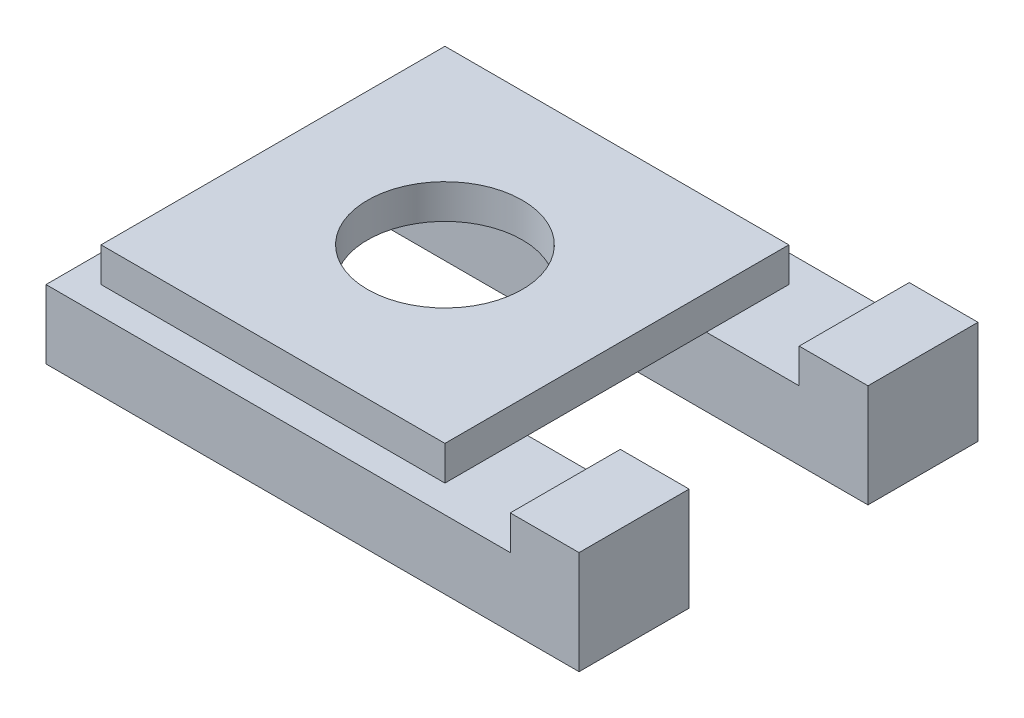
ISO-10303-21;
HEADER;
FILE_DESCRIPTION(('STEP AP214'),'2;1');
FILE_NAME('part.step','',(''),(''),'','','');
FILE_SCHEMA(('AUTOMOTIVE_DESIGN { 1 0 10303 214 1 1 1 1 }'));
ENDSEC;
DATA;
#1=APPLICATION_CONTEXT('core data for automotive mechanical design processes');
#2=APPLICATION_PROTOCOL_DEFINITION('international standard','automotive_design',2000,#1);
#3=PRODUCT_CONTEXT('',#1,'mechanical');
#4=PRODUCT('Part','Part','',(#3));
#5=PRODUCT_RELATED_PRODUCT_CATEGORY('part','',(#4));
#6=PRODUCT_DEFINITION_FORMATION('','',#4);
#7=PRODUCT_DEFINITION_CONTEXT('part definition',#1,'design');
#8=PRODUCT_DEFINITION('design','',#6,#7);
#9=PRODUCT_DEFINITION_SHAPE('','',#8);
#10=(LENGTH_UNIT() NAMED_UNIT(*) SI_UNIT(.MILLI.,.METRE.));
#11=(NAMED_UNIT(*) PLANE_ANGLE_UNIT() SI_UNIT($,.RADIAN.));
#12=(NAMED_UNIT(*) SI_UNIT($,.STERADIAN.) SOLID_ANGLE_UNIT());
#13=UNCERTAINTY_MEASURE_WITH_UNIT(LENGTH_MEASURE(1.E-05),#10,'distance_accuracy_value','');
#14=(GEOMETRIC_REPRESENTATION_CONTEXT(3) GLOBAL_UNCERTAINTY_ASSIGNED_CONTEXT((#13)) GLOBAL_UNIT_ASSIGNED_CONTEXT((#10,
#11,#12)) REPRESENTATION_CONTEXT('',''));
#15=CARTESIAN_POINT('',(0.,0.,0.));
#16=DIRECTION('',(0.,0.,1.));
#17=DIRECTION('',(1.,0.,0.));
#18=AXIS2_PLACEMENT_3D('',#15,#16,#17);
#19=CARTESIAN_POINT('',(0.,0.,0.));
#20=DIRECTION('',(0.,1.,0.));
#21=DIRECTION('',(0.,0.,1.));
#22=AXIS2_PLACEMENT_3D('',#19,#20,#21);
#23=PLANE('',#22);
#24=CARTESIAN_POINT('',(0.,0.,0.));
#25=DIRECTION('',(0.,1.,0.));
#26=DIRECTION('',(0.,0.,1.));
#27=AXIS2_PLACEMENT_3D('',#24,#25,#26);
#28=CIRCLE('',#27,22.5);
#29=CARTESIAN_POINT('',(0.,0.,22.5));
#30=VERTEX_POINT('',#29);
#31=EDGE_CURVE('E343',#30,#30,#28,.T.);
#32=ORIENTED_EDGE('',*,*,#31,.T.);
#33=EDGE_LOOP('',(#32));
#34=FACE_BOUND('',#33,.T.);
#35=DIRECTION('',(1.,0.,0.));
#36=VECTOR('',#35,1.);
#37=CARTESIAN_POINT('',(0.,0.,26.));
#38=LINE('',#37,#36);
#39=CARTESIAN_POINT('',(-50.,0.,26.));
#40=VERTEX_POINT('',#39);
#41=CARTESIAN_POINT('',(50.,0.,26.));
#42=VERTEX_POINT('',#41);
#43=EDGE_CURVE('E68',#40,#42,#38,.T.);
#44=ORIENTED_EDGE('',*,*,#43,.F.);
#45=DIRECTION('',(0.,0.,1.));
#46=VECTOR('',#45,1.);
#47=CARTESIAN_POINT('',(-50.,0.,0.));
#48=LINE('',#47,#46);
#49=CARTESIAN_POINT('',(-50.,0.,-26.));
#50=VERTEX_POINT('',#49);
#51=EDGE_CURVE('E369',#50,#40,#48,.T.);
#52=ORIENTED_EDGE('',*,*,#51,.F.);
#53=DIRECTION('',(1.,0.,0.));
#54=VECTOR('',#53,1.);
#55=CARTESIAN_POINT('',(0.,0.,-26.));
#56=LINE('',#55,#54);
#57=CARTESIAN_POINT('',(50.,0.,-26.));
#58=VERTEX_POINT('',#57);
#59=EDGE_CURVE('E339',#50,#58,#56,.T.);
#60=ORIENTED_EDGE('',*,*,#59,.T.);
#61=DIRECTION('',(0.,0.,1.));
#62=VECTOR('',#61,1.);
#63=CARTESIAN_POINT('',(50.,0.,0.));
#64=LINE('',#63,#62);
#65=EDGE_CURVE('E353',#58,#42,#64,.T.);
#66=ORIENTED_EDGE('',*,*,#65,.T.);
#67=EDGE_LOOP('',(#44,#52,#60,#66));
#68=FACE_BOUND('',#67,.T.);
#69=ADVANCED_FACE('F50',(#34,#68),#23,.F.);
#70=CARTESIAN_POINT('',(-50.,10.,0.));
#71=DIRECTION('',(1.,0.,0.));
#72=DIRECTION('',(0.,0.,-1.));
#73=AXIS2_PLACEMENT_3D('',#70,#71,#72);
#74=PLANE('',#73);
#75=ORIENTED_EDGE('',*,*,#51,.T.);
#76=DIRECTION('',(0.,0.,1.));
#77=VECTOR('',#76,1.);
#78=CARTESIAN_POINT('',(-50.,0.,0.));
#79=LINE('',#78,#77);
#80=CARTESIAN_POINT('',(-50.,0.,50.));
#81=VERTEX_POINT('',#80);
#82=EDGE_CURVE('E63',#40,#81,#79,.T.);
#83=ORIENTED_EDGE('',*,*,#82,.T.);
#84=DIRECTION('',(0.,-1.,0.));
#85=VECTOR('',#84,1.);
#86=CARTESIAN_POINT('',(-50.,10.,50.));
#87=LINE('',#86,#85);
#88=CARTESIAN_POINT('',(-50.,10.,50.));
#89=VERTEX_POINT('',#88);
#90=EDGE_CURVE('E11',#89,#81,#87,.T.);
#91=ORIENTED_EDGE('',*,*,#90,.F.);
#92=DIRECTION('',(0.,0.,1.));
#93=VECTOR('',#92,1.);
#94=CARTESIAN_POINT('',(-50.,10.,0.));
#95=LINE('',#94,#93);
#96=CARTESIAN_POINT('',(-50.,10.,-50.));
#97=VERTEX_POINT('',#96);
#98=EDGE_CURVE('E349',#97,#89,#95,.T.);
#99=ORIENTED_EDGE('',*,*,#98,.F.);
#100=DIRECTION('',(0.,-1.,0.));
#101=VECTOR('',#100,1.);
#102=CARTESIAN_POINT('',(-50.,10.,-50.));
#103=LINE('',#102,#101);
#104=CARTESIAN_POINT('',(-50.,0.,-50.));
#105=VERTEX_POINT('',#104);
#106=EDGE_CURVE('E366',#97,#105,#103,.T.);
#107=ORIENTED_EDGE('',*,*,#106,.T.);
#108=DIRECTION('',(0.,0.,1.));
#109=VECTOR('',#108,1.);
#110=CARTESIAN_POINT('',(-50.,0.,0.));
#111=LINE('',#110,#109);
#112=EDGE_CURVE('E287',#105,#50,#111,.T.);
#113=ORIENTED_EDGE('',*,*,#112,.T.);
#114=EDGE_LOOP('',(#75,#83,#91,#99,#107,#113));
#115=FACE_BOUND('',#114,.T.);
#116=ADVANCED_FACE('F420',(#115),#74,.F.);
#117=CARTESIAN_POINT('',(0.,10.,50.));
#118=DIRECTION('',(0.,0.,-1.));
#119=DIRECTION('',(-1.,0.,0.));
#120=AXIS2_PLACEMENT_3D('',#117,#118,#119);
#121=PLANE('',#120);
#122=ORIENTED_EDGE('',*,*,#90,.T.);
#123=DIRECTION('',(1.,0.,0.));
#124=VECTOR('',#123,1.);
#125=CARTESIAN_POINT('',(0.,0.,50.));
#126=LINE('',#125,#124);
#127=CARTESIAN_POINT('',(50.,0.,50.));
#128=VERTEX_POINT('',#127);
#129=EDGE_CURVE('E217',#81,#128,#126,.T.);
#130=ORIENTED_EDGE('',*,*,#129,.T.);
#131=DIRECTION('',(0.,-1.,0.));
#132=VECTOR('',#131,1.);
#133=CARTESIAN_POINT('',(50.,10.,50.));
#134=LINE('',#133,#132);
#135=CARTESIAN_POINT('',(50.,10.,50.));
#136=VERTEX_POINT('',#135);
#137=EDGE_CURVE('E57',#136,#128,#134,.T.);
#138=ORIENTED_EDGE('',*,*,#137,.F.);
#139=DIRECTION('',(1.,0.,0.));
#140=VECTOR('',#139,1.);
#141=CARTESIAN_POINT('',(0.,10.,50.));
#142=LINE('',#141,#140);
#143=EDGE_CURVE('E352',#89,#136,#142,.T.);
#144=ORIENTED_EDGE('',*,*,#143,.F.);
#145=EDGE_LOOP('',(#122,#130,#138,#144));
#146=FACE_BOUND('',#145,.T.);
#147=ADVANCED_FACE('F388',(#146),#121,.F.);
#148=CARTESIAN_POINT('',(50.,10.,0.));
#149=DIRECTION('',(1.,0.,0.));
#150=DIRECTION('',(0.,0.,-1.));
#151=AXIS2_PLACEMENT_3D('',#148,#149,#150);
#152=PLANE('',#151);
#153=DIRECTION('',(0.,0.,1.));
#154=VECTOR('',#153,1.);
#155=CARTESIAN_POINT('',(50.,0.,0.));
#156=LINE('',#155,#154);
#157=EDGE_CURVE('E218',#42,#128,#156,.T.);
#158=ORIENTED_EDGE('',*,*,#157,.F.);
#159=ORIENTED_EDGE('',*,*,#65,.F.);
#160=DIRECTION('',(0.,0.,1.));
#161=VECTOR('',#160,1.);
#162=CARTESIAN_POINT('',(50.,0.,0.));
#163=LINE('',#162,#161);
#164=CARTESIAN_POINT('',(50.,0.,-50.));
#165=VERTEX_POINT('',#164);
#166=EDGE_CURVE('E294',#165,#58,#163,.T.);
#167=ORIENTED_EDGE('',*,*,#166,.F.);
#168=DIRECTION('',(0.,-1.,0.));
#169=VECTOR('',#168,1.);
#170=CARTESIAN_POINT('',(50.,10.,-50.));
#171=LINE('',#170,#169);
#172=CARTESIAN_POINT('',(50.,10.,-50.));
#173=VERTEX_POINT('',#172);
#174=EDGE_CURVE('E378',#173,#165,#171,.T.);
#175=ORIENTED_EDGE('',*,*,#174,.F.);
#176=DIRECTION('',(0.,0.,1.));
#177=VECTOR('',#176,1.);
#178=CARTESIAN_POINT('',(50.,10.,0.));
#179=LINE('',#178,#177);
#180=EDGE_CURVE('E358',#173,#136,#179,.T.);
#181=ORIENTED_EDGE('',*,*,#180,.T.);
#182=ORIENTED_EDGE('',*,*,#137,.T.);
#183=EDGE_LOOP('',(#158,#159,#167,#175,#181,#182));
#184=FACE_BOUND('',#183,.T.);
#185=ADVANCED_FACE('F381',(#184),#152,.T.);
#186=CARTESIAN_POINT('',(0.,10.,0.));
#187=DIRECTION('',(0.,-1.,0.));
#188=DIRECTION('',(0.,0.,-1.));
#189=AXIS2_PLACEMENT_3D('',#186,#187,#188);
#190=CYLINDRICAL_SURFACE('',#189,22.5);
#191=CARTESIAN_POINT('',(0.,10.,0.));
#192=DIRECTION('',(0.,1.,0.));
#193=DIRECTION('',(0.,0.,1.));
#194=AXIS2_PLACEMENT_3D('',#191,#192,#193);
#195=CIRCLE('',#194,22.5);
#196=CARTESIAN_POINT('',(0.,10.,22.5));
#197=VERTEX_POINT('',#196);
#198=EDGE_CURVE('E348',#197,#197,#195,.T.);
#199=ORIENTED_EDGE('',*,*,#198,.T.);
#200=EDGE_LOOP('',(#199));
#201=FACE_BOUND('',#200,.T.);
#202=ORIENTED_EDGE('',*,*,#31,.F.);
#203=EDGE_LOOP('',(#202));
#204=FACE_BOUND('',#203,.T.);
#205=ADVANCED_FACE('F47',(#201,#204),#190,.F.);
#206=CARTESIAN_POINT('',(0.,10.,-50.));
#207=DIRECTION('',(0.,0.,-1.));
#208=DIRECTION('',(-1.,0.,0.));
#209=AXIS2_PLACEMENT_3D('',#206,#207,#208);
#210=PLANE('',#209);
#211=DIRECTION('',(1.,0.,0.));
#212=VECTOR('',#211,1.);
#213=CARTESIAN_POINT('',(0.,0.,-50.));
#214=LINE('',#213,#212);
#215=EDGE_CURVE('E286',#105,#165,#214,.T.);
#216=ORIENTED_EDGE('',*,*,#215,.F.);
#217=ORIENTED_EDGE('',*,*,#106,.F.);
#218=DIRECTION('',(1.,0.,0.));
#219=VECTOR('',#218,1.);
#220=CARTESIAN_POINT('',(0.,10.,-50.));
#221=LINE('',#220,#219);
#222=EDGE_CURVE('E365',#97,#173,#221,.T.);
#223=ORIENTED_EDGE('',*,*,#222,.T.);
#224=ORIENTED_EDGE('',*,*,#174,.T.);
#225=EDGE_LOOP('',(#216,#217,#223,#224));
#226=FACE_BOUND('',#225,.T.);
#227=ADVANCED_FACE('F426',(#226),#210,.T.);
#228=CARTESIAN_POINT('',(0.,10.,0.));
#229=DIRECTION('',(0.,1.,0.));
#230=DIRECTION('',(0.,0.,1.));
#231=AXIS2_PLACEMENT_3D('',#228,#229,#230);
#232=PLANE('',#231);
#233=ORIENTED_EDGE('',*,*,#198,.F.);
#234=EDGE_LOOP('',(#233));
#235=FACE_BOUND('',#234,.T.);
#236=ORIENTED_EDGE('',*,*,#98,.T.);
#237=ORIENTED_EDGE('',*,*,#143,.T.);
#238=ORIENTED_EDGE('',*,*,#180,.F.);
#239=ORIENTED_EDGE('',*,*,#222,.F.);
#240=EDGE_LOOP('',(#236,#237,#238,#239));
#241=FACE_BOUND('',#240,.T.);
#242=ADVANCED_FACE('F427',(#235,#241),#232,.T.);
#243=CARTESIAN_POINT('',(0.,-20.,-26.));
#244=DIRECTION('',(0.,0.,1.));
#245=DIRECTION('',(1.,0.,0.));
#246=AXIS2_PLACEMENT_3D('',#243,#244,#245);
#247=PLANE('',#246);
#248=ORIENTED_EDGE('',*,*,#59,.F.);
#249=DIRECTION('',(1.,0.,0.));
#250=VECTOR('',#249,1.);
#251=CARTESIAN_POINT('',(0.,0.,-26.));
#252=LINE('',#251,#250);
#253=CARTESIAN_POINT('',(-58.,0.,-26.));
#254=VERTEX_POINT('',#253);
#255=EDGE_CURVE('E285',#254,#50,#252,.T.);
#256=ORIENTED_EDGE('',*,*,#255,.F.);
#257=DIRECTION('',(0.,1.,0.));
#258=VECTOR('',#257,1.);
#259=CARTESIAN_POINT('',(-58.,-20.,-26.));
#260=LINE('',#259,#258);
#261=CARTESIAN_POINT('',(-58.,-20.,-26.));
#262=VERTEX_POINT('',#261);
#263=EDGE_CURVE('E277',#262,#254,#260,.T.);
#264=ORIENTED_EDGE('',*,*,#263,.F.);
#265=DIRECTION('',(1.,0.,0.));
#266=VECTOR('',#265,1.);
#267=CARTESIAN_POINT('',(0.,-20.,-26.));
#268=LINE('',#267,#266);
#269=CARTESIAN_POINT('',(97.,-20.,-26.));
#270=VERTEX_POINT('',#269);
#271=EDGE_CURVE('E338',#262,#270,#268,.T.);
#272=ORIENTED_EDGE('',*,*,#271,.T.);
#273=DIRECTION('',(0.,-1.,0.));
#274=VECTOR('',#273,1.);
#275=CARTESIAN_POINT('',(97.,10.,-26.));
#276=LINE('',#275,#274);
#277=CARTESIAN_POINT('',(97.,10.,-26.));
#278=VERTEX_POINT('',#277);
#279=EDGE_CURVE('E321',#278,#270,#276,.T.);
#280=ORIENTED_EDGE('',*,*,#279,.F.);
#281=DIRECTION('',(1.,0.,0.));
#282=VECTOR('',#281,1.);
#283=CARTESIAN_POINT('',(0.,10.,-26.));
#284=LINE('',#283,#282);
#285=CARTESIAN_POINT('',(77.,10.,-26.));
#286=VERTEX_POINT('',#285);
#287=EDGE_CURVE('E318',#286,#278,#284,.T.);
#288=ORIENTED_EDGE('',*,*,#287,.F.);
#289=DIRECTION('',(0.,-1.,0.));
#290=VECTOR('',#289,1.);
#291=CARTESIAN_POINT('',(77.,10.,-26.));
#292=LINE('',#291,#290);
#293=CARTESIAN_POINT('',(77.,0.,-26.));
#294=VERTEX_POINT('',#293);
#295=EDGE_CURVE('E329',#286,#294,#292,.T.);
#296=ORIENTED_EDGE('',*,*,#295,.T.);
#297=EDGE_CURVE('E290',#58,#294,#252,.T.);
#298=ORIENTED_EDGE('',*,*,#297,.F.);
#299=EDGE_LOOP('',(#248,#256,#264,#272,#280,#288,#296,#298));
#300=FACE_BOUND('',#299,.T.);
#301=ADVANCED_FACE('F452',(#300),#247,.T.);
#302=CARTESIAN_POINT('',(0.,-20.,0.));
#303=DIRECTION('',(0.,1.,0.));
#304=DIRECTION('',(0.,0.,1.));
#305=AXIS2_PLACEMENT_3D('',#302,#303,#304);
#306=PLANE('',#305);
#307=ORIENTED_EDGE('',*,*,#271,.F.);
#308=DIRECTION('',(0.,0.,1.));
#309=VECTOR('',#308,1.);
#310=CARTESIAN_POINT('',(-58.,-20.,0.));
#311=LINE('',#310,#309);
#312=CARTESIAN_POINT('',(-58.,-20.,-58.));
#313=VERTEX_POINT('',#312);
#314=EDGE_CURVE('E262',#313,#262,#311,.T.);
#315=ORIENTED_EDGE('',*,*,#314,.F.);
#316=DIRECTION('',(1.,0.,0.));
#317=VECTOR('',#316,1.);
#318=CARTESIAN_POINT('',(0.,-20.,-58.));
#319=LINE('',#318,#317);
#320=CARTESIAN_POINT('',(97.,-20.,-58.));
#321=VERTEX_POINT('',#320);
#322=EDGE_CURVE('E272',#313,#321,#319,.T.);
#323=ORIENTED_EDGE('',*,*,#322,.T.);
#324=DIRECTION('',(0.,0.,1.));
#325=VECTOR('',#324,1.);
#326=CARTESIAN_POINT('',(96.9999999999999,-20.,0.));
#327=LINE('',#326,#325);
#328=EDGE_CURVE('E267',#321,#270,#327,.T.);
#329=ORIENTED_EDGE('',*,*,#328,.T.);
#330=EDGE_LOOP('',(#307,#315,#323,#329));
#331=FACE_BOUND('',#330,.T.);
#332=ADVANCED_FACE('F460',(#331),#306,.F.);
#333=CARTESIAN_POINT('',(96.9999999999999,10.,0.));
#334=DIRECTION('',(1.,0.,0.));
#335=DIRECTION('',(0.,0.,-1.));
#336=AXIS2_PLACEMENT_3D('',#333,#334,#335);
#337=PLANE('',#336);
#338=ORIENTED_EDGE('',*,*,#279,.T.);
#339=ORIENTED_EDGE('',*,*,#328,.F.);
#340=DIRECTION('',(0.,-1.,0.));
#341=VECTOR('',#340,1.);
#342=CARTESIAN_POINT('',(97.,10.,-58.));
#343=LINE('',#342,#341);
#344=CARTESIAN_POINT('',(97.,10.,-58.));
#345=VERTEX_POINT('',#344);
#346=EDGE_CURVE('E337',#345,#321,#343,.T.);
#347=ORIENTED_EDGE('',*,*,#346,.F.);
#348=DIRECTION('',(0.,0.,1.));
#349=VECTOR('',#348,1.);
#350=CARTESIAN_POINT('',(96.9999999999999,10.,0.));
#351=LINE('',#350,#349);
#352=EDGE_CURVE('E310',#345,#278,#351,.T.);
#353=ORIENTED_EDGE('',*,*,#352,.T.);
#354=EDGE_LOOP('',(#338,#339,#347,#353));
#355=FACE_BOUND('',#354,.T.);
#356=ADVANCED_FACE('F463',(#355),#337,.T.);
#357=CARTESIAN_POINT('',(0.,10.,-58.));
#358=DIRECTION('',(0.,0.,-1.));
#359=DIRECTION('',(-1.,0.,0.));
#360=AXIS2_PLACEMENT_3D('',#357,#358,#359);
#361=PLANE('',#360);
#362=ORIENTED_EDGE('',*,*,#346,.T.);
#363=ORIENTED_EDGE('',*,*,#322,.F.);
#364=DIRECTION('',(0.,1.,0.));
#365=VECTOR('',#364,1.);
#366=CARTESIAN_POINT('',(-58.,-20.,-58.));
#367=LINE('',#366,#365);
#368=CARTESIAN_POINT('',(-58.,0.,-58.));
#369=VERTEX_POINT('',#368);
#370=EDGE_CURVE('E303',#313,#369,#367,.T.);
#371=ORIENTED_EDGE('',*,*,#370,.T.);
#372=DIRECTION('',(1.,0.,0.));
#373=VECTOR('',#372,1.);
#374=CARTESIAN_POINT('',(0.,0.,-58.));
#375=LINE('',#374,#373);
#376=CARTESIAN_POINT('',(77.,0.,-58.));
#377=VERTEX_POINT('',#376);
#378=EDGE_CURVE('E269',#369,#377,#375,.T.);
#379=ORIENTED_EDGE('',*,*,#378,.T.);
#380=DIRECTION('',(0.,-1.,0.));
#381=VECTOR('',#380,1.);
#382=CARTESIAN_POINT('',(77.,10.,-58.));
#383=LINE('',#382,#381);
#384=CARTESIAN_POINT('',(77.,10.,-58.));
#385=VERTEX_POINT('',#384);
#386=EDGE_CURVE('E335',#385,#377,#383,.T.);
#387=ORIENTED_EDGE('',*,*,#386,.F.);
#388=DIRECTION('',(1.,0.,0.));
#389=VECTOR('',#388,1.);
#390=CARTESIAN_POINT('',(0.,10.,-58.));
#391=LINE('',#390,#389);
#392=EDGE_CURVE('E311',#385,#345,#391,.T.);
#393=ORIENTED_EDGE('',*,*,#392,.T.);
#394=EDGE_LOOP('',(#362,#363,#371,#379,#387,#393));
#395=FACE_BOUND('',#394,.T.);
#396=ADVANCED_FACE('F473',(#395),#361,.T.);
#397=CARTESIAN_POINT('',(77.,10.,0.));
#398=DIRECTION('',(1.,0.,0.));
#399=DIRECTION('',(0.,0.,-1.));
#400=AXIS2_PLACEMENT_3D('',#397,#398,#399);
#401=PLANE('',#400);
#402=DIRECTION('',(0.,0.,1.));
#403=VECTOR('',#402,1.);
#404=CARTESIAN_POINT('',(77.,0.,0.));
#405=LINE('',#404,#403);
#406=EDGE_CURVE('E305',#377,#294,#405,.T.);
#407=ORIENTED_EDGE('',*,*,#406,.T.);
#408=ORIENTED_EDGE('',*,*,#295,.F.);
#409=DIRECTION('',(0.,0.,1.));
#410=VECTOR('',#409,1.);
#411=CARTESIAN_POINT('',(77.,10.,0.));
#412=LINE('',#411,#410);
#413=EDGE_CURVE('E314',#385,#286,#412,.T.);
#414=ORIENTED_EDGE('',*,*,#413,.F.);
#415=ORIENTED_EDGE('',*,*,#386,.T.);
#416=EDGE_LOOP('',(#407,#408,#414,#415));
#417=FACE_BOUND('',#416,.T.);
#418=ADVANCED_FACE('F485',(#417),#401,.F.);
#419=CARTESIAN_POINT('',(0.,10.,0.));
#420=DIRECTION('',(0.,1.,0.));
#421=DIRECTION('',(0.,0.,1.));
#422=AXIS2_PLACEMENT_3D('',#419,#420,#421);
#423=PLANE('',#422);
#424=ORIENTED_EDGE('',*,*,#352,.F.);
#425=ORIENTED_EDGE('',*,*,#392,.F.);
#426=ORIENTED_EDGE('',*,*,#413,.T.);
#427=ORIENTED_EDGE('',*,*,#287,.T.);
#428=EDGE_LOOP('',(#424,#425,#426,#427));
#429=FACE_BOUND('',#428,.T.);
#430=ADVANCED_FACE('F495',(#429),#423,.T.);
#431=CARTESIAN_POINT('',(0.,0.,0.));
#432=DIRECTION('',(0.,1.,0.));
#433=DIRECTION('',(0.,0.,1.));
#434=AXIS2_PLACEMENT_3D('',#431,#432,#433);
#435=PLANE('',#434);
#436=ORIENTED_EDGE('',*,*,#406,.F.);
#437=ORIENTED_EDGE('',*,*,#378,.F.);
#438=DIRECTION('',(0.,0.,1.));
#439=VECTOR('',#438,1.);
#440=CARTESIAN_POINT('',(-58.,0.,0.));
#441=LINE('',#440,#439);
#442=EDGE_CURVE('E265',#369,#254,#441,.T.);
#443=ORIENTED_EDGE('',*,*,#442,.T.);
#444=ORIENTED_EDGE('',*,*,#255,.T.);
#445=ORIENTED_EDGE('',*,*,#112,.F.);
#446=ORIENTED_EDGE('',*,*,#215,.T.);
#447=ORIENTED_EDGE('',*,*,#166,.T.);
#448=ORIENTED_EDGE('',*,*,#297,.T.);
#449=EDGE_LOOP('',(#436,#437,#443,#444,#445,#446,#447,#448));
#450=FACE_BOUND('',#449,.T.);
#451=ADVANCED_FACE('F499',(#450),#435,.T.);
#452=CARTESIAN_POINT('',(-58.,-20.,0.));
#453=DIRECTION('',(-1.,0.,0.));
#454=DIRECTION('',(0.,0.,1.));
#455=AXIS2_PLACEMENT_3D('',#452,#453,#454);
#456=PLANE('',#455);
#457=ORIENTED_EDGE('',*,*,#442,.F.);
#458=ORIENTED_EDGE('',*,*,#370,.F.);
#459=ORIENTED_EDGE('',*,*,#314,.T.);
#460=ORIENTED_EDGE('',*,*,#263,.T.);
#461=EDGE_LOOP('',(#457,#458,#459,#460));
#462=FACE_BOUND('',#461,.T.);
#463=ADVANCED_FACE('F509',(#462),#456,.T.);
#464=CARTESIAN_POINT('',(0.,-20.,26.));
#465=DIRECTION('',(0.,0.,1.));
#466=DIRECTION('',(1.,0.,0.));
#467=AXIS2_PLACEMENT_3D('',#464,#465,#466);
#468=PLANE('',#467);
#469=ORIENTED_EDGE('',*,*,#43,.T.);
#470=DIRECTION('',(1.,0.,0.));
#471=VECTOR('',#470,1.);
#472=CARTESIAN_POINT('',(0.,0.,26.));
#473=LINE('',#472,#471);
#474=CARTESIAN_POINT('',(77.,0.,26.));
#475=VERTEX_POINT('',#474);
#476=EDGE_CURVE('E212',#42,#475,#473,.T.);
#477=ORIENTED_EDGE('',*,*,#476,.T.);
#478=DIRECTION('',(0.,-1.,0.));
#479=VECTOR('',#478,1.);
#480=CARTESIAN_POINT('',(77.,10.,26.));
#481=LINE('',#480,#479);
#482=CARTESIAN_POINT('',(77.,10.,26.));
#483=VERTEX_POINT('',#482);
#484=EDGE_CURVE('E258',#483,#475,#481,.T.);
#485=ORIENTED_EDGE('',*,*,#484,.F.);
#486=DIRECTION('',(1.,0.,0.));
#487=VECTOR('',#486,1.);
#488=CARTESIAN_POINT('',(0.,10.,26.));
#489=LINE('',#488,#487);
#490=CARTESIAN_POINT('',(97.,10.,26.));
#491=VERTEX_POINT('',#490);
#492=EDGE_CURVE('E227',#483,#491,#489,.T.);
#493=ORIENTED_EDGE('',*,*,#492,.T.);
#494=DIRECTION('',(0.,-1.,0.));
#495=VECTOR('',#494,1.);
#496=CARTESIAN_POINT('',(97.,10.,26.));
#497=LINE('',#496,#495);
#498=CARTESIAN_POINT('',(97.,-20.,26.));
#499=VERTEX_POINT('',#498);
#500=EDGE_CURVE('E243',#491,#499,#497,.T.);
#501=ORIENTED_EDGE('',*,*,#500,.T.);
#502=DIRECTION('',(1.,0.,0.));
#503=VECTOR('',#502,1.);
#504=CARTESIAN_POINT('',(0.,-20.,26.));
#505=LINE('',#504,#503);
#506=CARTESIAN_POINT('',(-58.,-20.,26.));
#507=VERTEX_POINT('',#506);
#508=EDGE_CURVE('E260',#507,#499,#505,.T.);
#509=ORIENTED_EDGE('',*,*,#508,.F.);
#510=DIRECTION('',(0.,1.,0.));
#511=VECTOR('',#510,1.);
#512=CARTESIAN_POINT('',(-58.,-20.,26.));
#513=LINE('',#512,#511);
#514=CARTESIAN_POINT('',(-58.,0.,26.));
#515=VERTEX_POINT('',#514);
#516=EDGE_CURVE('E190',#507,#515,#513,.T.);
#517=ORIENTED_EDGE('',*,*,#516,.T.);
#518=EDGE_CURVE('E200',#515,#40,#473,.T.);
#519=ORIENTED_EDGE('',*,*,#518,.T.);
#520=EDGE_LOOP('',(#469,#477,#485,#493,#501,#509,#517,#519));
#521=FACE_BOUND('',#520,.T.);
#522=ADVANCED_FACE('F395',(#521),#468,.F.);
#523=CARTESIAN_POINT('',(0.,-20.,0.));
#524=DIRECTION('',(0.,1.,0.));
#525=DIRECTION('',(0.,0.,1.));
#526=AXIS2_PLACEMENT_3D('',#523,#524,#525);
#527=PLANE('',#526);
#528=ORIENTED_EDGE('',*,*,#508,.T.);
#529=DIRECTION('',(0.,0.,-1.));
#530=VECTOR('',#529,1.);
#531=CARTESIAN_POINT('',(96.9999999999999,-20.,0.));
#532=LINE('',#531,#530);
#533=CARTESIAN_POINT('',(97.,-20.,58.));
#534=VERTEX_POINT('',#533);
#535=EDGE_CURVE('E187',#534,#499,#532,.T.);
#536=ORIENTED_EDGE('',*,*,#535,.F.);
#537=DIRECTION('',(1.,0.,0.));
#538=VECTOR('',#537,1.);
#539=CARTESIAN_POINT('',(0.,-20.,58.));
#540=LINE('',#539,#538);
#541=CARTESIAN_POINT('',(-58.,-20.,58.));
#542=VERTEX_POINT('',#541);
#543=EDGE_CURVE('E179',#542,#534,#540,.T.);
#544=ORIENTED_EDGE('',*,*,#543,.F.);
#545=DIRECTION('',(0.,0.,-1.));
#546=VECTOR('',#545,1.);
#547=CARTESIAN_POINT('',(-58.,-20.,0.));
#548=LINE('',#547,#546);
#549=EDGE_CURVE('E195',#542,#507,#548,.T.);
#550=ORIENTED_EDGE('',*,*,#549,.T.);
#551=EDGE_LOOP('',(#528,#536,#544,#550));
#552=FACE_BOUND('',#551,.T.);
#553=ADVANCED_FACE('F196',(#552),#527,.F.);
#554=CARTESIAN_POINT('',(77.,10.,0.));
#555=DIRECTION('',(-1.,0.,0.));
#556=DIRECTION('',(0.,0.,1.));
#557=AXIS2_PLACEMENT_3D('',#554,#555,#556);
#558=PLANE('',#557);
#559=DIRECTION('',(0.,0.,-1.));
#560=VECTOR('',#559,1.);
#561=CARTESIAN_POINT('',(77.,0.,0.));
#562=LINE('',#561,#560);
#563=CARTESIAN_POINT('',(77.,0.,58.));
#564=VERTEX_POINT('',#563);
#565=EDGE_CURVE('E230',#564,#475,#562,.T.);
#566=ORIENTED_EDGE('',*,*,#565,.F.);
#567=DIRECTION('',(0.,-1.,0.));
#568=VECTOR('',#567,1.);
#569=CARTESIAN_POINT('',(77.,10.,58.));
#570=LINE('',#569,#568);
#571=CARTESIAN_POINT('',(77.,10.,58.));
#572=VERTEX_POINT('',#571);
#573=EDGE_CURVE('E253',#572,#564,#570,.T.);
#574=ORIENTED_EDGE('',*,*,#573,.F.);
#575=DIRECTION('',(0.,0.,-1.));
#576=VECTOR('',#575,1.);
#577=CARTESIAN_POINT('',(77.,10.,0.));
#578=LINE('',#577,#576);
#579=EDGE_CURVE('E232',#572,#483,#578,.T.);
#580=ORIENTED_EDGE('',*,*,#579,.T.);
#581=ORIENTED_EDGE('',*,*,#484,.T.);
#582=EDGE_LOOP('',(#566,#574,#580,#581));
#583=FACE_BOUND('',#582,.T.);
#584=ADVANCED_FACE('F410',(#583),#558,.T.);
#585=CARTESIAN_POINT('',(0.,10.,58.));
#586=DIRECTION('',(0.,0.,-1.));
#587=DIRECTION('',(-1.,0.,0.));
#588=AXIS2_PLACEMENT_3D('',#585,#586,#587);
#589=PLANE('',#588);
#590=ORIENTED_EDGE('',*,*,#573,.T.);
#591=DIRECTION('',(1.,0.,0.));
#592=VECTOR('',#591,1.);
#593=CARTESIAN_POINT('',(0.,0.,58.));
#594=LINE('',#593,#592);
#595=CARTESIAN_POINT('',(-58.,0.,58.));
#596=VERTEX_POINT('',#595);
#597=EDGE_CURVE('E185',#596,#564,#594,.T.);
#598=ORIENTED_EDGE('',*,*,#597,.F.);
#599=DIRECTION('',(0.,1.,0.));
#600=VECTOR('',#599,1.);
#601=CARTESIAN_POINT('',(-58.,-20.,58.));
#602=LINE('',#601,#600);
#603=EDGE_CURVE('E172',#542,#596,#602,.T.);
#604=ORIENTED_EDGE('',*,*,#603,.F.);
#605=ORIENTED_EDGE('',*,*,#543,.T.);
#606=DIRECTION('',(0.,-1.,0.));
#607=VECTOR('',#606,1.);
#608=CARTESIAN_POINT('',(97.,10.,58.));
#609=LINE('',#608,#607);
#610=CARTESIAN_POINT('',(97.,10.,58.));
#611=VERTEX_POINT('',#610);
#612=EDGE_CURVE('E248',#611,#534,#609,.T.);
#613=ORIENTED_EDGE('',*,*,#612,.F.);
#614=DIRECTION('',(1.,0.,0.));
#615=VECTOR('',#614,1.);
#616=CARTESIAN_POINT('',(0.,10.,58.));
#617=LINE('',#616,#615);
#618=EDGE_CURVE('E240',#572,#611,#617,.T.);
#619=ORIENTED_EDGE('',*,*,#618,.F.);
#620=EDGE_LOOP('',(#590,#598,#604,#605,#613,#619));
#621=FACE_BOUND('',#620,.T.);
#622=ADVANCED_FACE('F180',(#621),#589,.F.);
#623=CARTESIAN_POINT('',(96.9999999999999,10.,0.));
#624=DIRECTION('',(-1.,0.,0.));
#625=DIRECTION('',(0.,0.,1.));
#626=AXIS2_PLACEMENT_3D('',#623,#624,#625);
#627=PLANE('',#626);
#628=ORIENTED_EDGE('',*,*,#612,.T.);
#629=ORIENTED_EDGE('',*,*,#535,.T.);
#630=ORIENTED_EDGE('',*,*,#500,.F.);
#631=DIRECTION('',(0.,0.,-1.));
#632=VECTOR('',#631,1.);
#633=CARTESIAN_POINT('',(96.9999999999999,10.,0.));
#634=LINE('',#633,#632);
#635=EDGE_CURVE('E238',#611,#491,#634,.T.);
#636=ORIENTED_EDGE('',*,*,#635,.F.);
#637=EDGE_LOOP('',(#628,#629,#630,#636));
#638=FACE_BOUND('',#637,.T.);
#639=ADVANCED_FACE('F401',(#638),#627,.F.);
#640=CARTESIAN_POINT('',(0.,10.,0.));
#641=DIRECTION('',(0.,1.,0.));
#642=DIRECTION('',(0.,0.,1.));
#643=AXIS2_PLACEMENT_3D('',#640,#641,#642);
#644=PLANE('',#643);
#645=ORIENTED_EDGE('',*,*,#492,.F.);
#646=ORIENTED_EDGE('',*,*,#579,.F.);
#647=ORIENTED_EDGE('',*,*,#618,.T.);
#648=ORIENTED_EDGE('',*,*,#635,.T.);
#649=EDGE_LOOP('',(#645,#646,#647,#648));
#650=FACE_BOUND('',#649,.T.);
#651=ADVANCED_FACE('F404',(#650),#644,.T.);
#652=CARTESIAN_POINT('',(-58.,-20.,0.));
#653=DIRECTION('',(1.,0.,0.));
#654=DIRECTION('',(0.,0.,-1.));
#655=AXIS2_PLACEMENT_3D('',#652,#653,#654);
#656=PLANE('',#655);
#657=DIRECTION('',(0.,0.,-1.));
#658=VECTOR('',#657,1.);
#659=CARTESIAN_POINT('',(-58.,0.,0.));
#660=LINE('',#659,#658);
#661=EDGE_CURVE('E210',#596,#515,#660,.T.);
#662=ORIENTED_EDGE('',*,*,#661,.T.);
#663=ORIENTED_EDGE('',*,*,#516,.F.);
#664=ORIENTED_EDGE('',*,*,#549,.F.);
#665=ORIENTED_EDGE('',*,*,#603,.T.);
#666=EDGE_LOOP('',(#662,#663,#664,#665));
#667=FACE_BOUND('',#666,.T.);
#668=ADVANCED_FACE('F194',(#667),#656,.F.);
#669=CARTESIAN_POINT('',(0.,0.,0.));
#670=DIRECTION('',(0.,1.,0.));
#671=DIRECTION('',(0.,0.,1.));
#672=AXIS2_PLACEMENT_3D('',#669,#670,#671);
#673=PLANE('',#672);
#674=ORIENTED_EDGE('',*,*,#597,.T.);
#675=ORIENTED_EDGE('',*,*,#565,.T.);
#676=ORIENTED_EDGE('',*,*,#476,.F.);
#677=ORIENTED_EDGE('',*,*,#157,.T.);
#678=ORIENTED_EDGE('',*,*,#129,.F.);
#679=ORIENTED_EDGE('',*,*,#82,.F.);
#680=ORIENTED_EDGE('',*,*,#518,.F.);
#681=ORIENTED_EDGE('',*,*,#661,.F.);
#682=EDGE_LOOP('',(#674,#675,#676,#677,#678,#679,#680,#681));
#683=FACE_BOUND('',#682,.T.);
#684=ADVANCED_FACE('F393',(#683),#673,.T.);
#685=CLOSED_SHELL('',(#69,#116,#147,#185,#205,#227,#242,#301,#332,#356,#396,#418,#430,#451,#463,
#522,#553,#584,#622,#639,#651,#668,#684));
#686=MANIFOLD_SOLID_BREP('B2',#685);
#687=ADVANCED_BREP_SHAPE_REPRESENTATION('',(#18,#686),#14);
#688=SHAPE_DEFINITION_REPRESENTATION(#9,#687);
ENDSEC;
END-ISO-10303-21;
